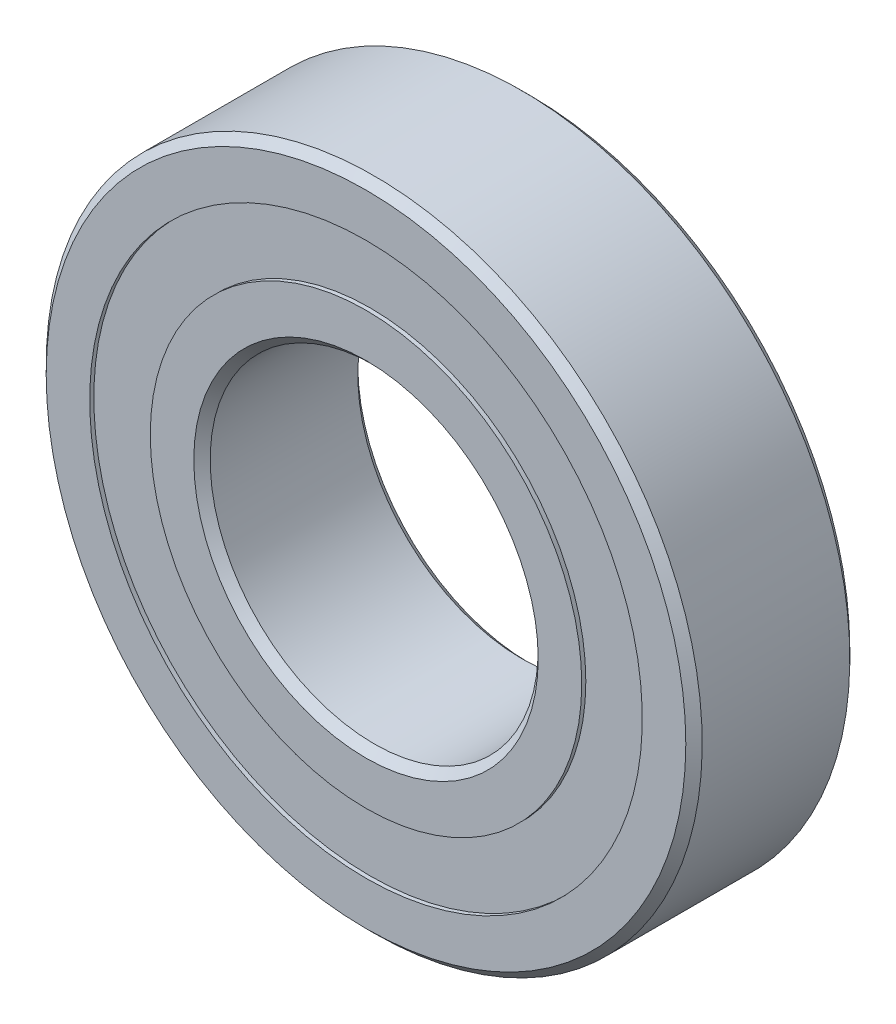
ISO-10303-21;
HEADER;
FILE_DESCRIPTION(('STEP AP214'),'2;1');
FILE_NAME('part.step','',(''),(''),'','','');
FILE_SCHEMA(('AUTOMOTIVE_DESIGN { 1 0 10303 214 1 1 1 1 }'));
ENDSEC;
DATA;
#1=APPLICATION_CONTEXT('core data for automotive mechanical design processes');
#2=APPLICATION_PROTOCOL_DEFINITION('international standard','automotive_design',2000,#1);
#3=PRODUCT_CONTEXT('',#1,'mechanical');
#4=PRODUCT('Part','Part','',(#3));
#5=PRODUCT_RELATED_PRODUCT_CATEGORY('part','',(#4));
#6=PRODUCT_DEFINITION_FORMATION('','',#4);
#7=PRODUCT_DEFINITION_CONTEXT('part definition',#1,'design');
#8=PRODUCT_DEFINITION('design','',#6,#7);
#9=PRODUCT_DEFINITION_SHAPE('','',#8);
#10=(LENGTH_UNIT() NAMED_UNIT(*) SI_UNIT(.MILLI.,.METRE.));
#11=(NAMED_UNIT(*) PLANE_ANGLE_UNIT() SI_UNIT($,.RADIAN.));
#12=(NAMED_UNIT(*) SI_UNIT($,.STERADIAN.) SOLID_ANGLE_UNIT());
#13=UNCERTAINTY_MEASURE_WITH_UNIT(LENGTH_MEASURE(1.E-05),#10,'distance_accuracy_value','');
#14=(GEOMETRIC_REPRESENTATION_CONTEXT(3) GLOBAL_UNCERTAINTY_ASSIGNED_CONTEXT((#13)) GLOBAL_UNIT_ASSIGNED_CONTEXT((#10,
#11,#12)) REPRESENTATION_CONTEXT('',''));
#15=CARTESIAN_POINT('',(0.,0.,0.));
#16=DIRECTION('',(0.,0.,1.));
#17=DIRECTION('',(1.,0.,0.));
#18=AXIS2_PLACEMENT_3D('',#15,#16,#17);
#19=CARTESIAN_POINT('',(0.,21.3946153846154,-6.0325));
#20=DIRECTION('',(0.,0.,1.));
#21=DIRECTION('',(0.,-1.,0.));
#22=AXIS2_PLACEMENT_3D('',#19,#20,#21);
#23=PLANE('',#22);
#24=CARTESIAN_POINT('',(0.,0.,-6.03250000000001));
#25=DIRECTION('',(0.,0.,1.));
#26=DIRECTION('',(0.,-1.,0.));
#27=AXIS2_PLACEMENT_3D('',#24,#25,#26);
#28=CIRCLE('',#27,21.3946153846154);
#29=CARTESIAN_POINT('',(0.,-21.3946153846154,-6.03250000000001));
#30=VERTEX_POINT('',#29);
#31=EDGE_CURVE('E71',#30,#30,#28,.T.);
#32=ORIENTED_EDGE('',*,*,#31,.F.);
#33=EDGE_LOOP('',(#32));
#34=FACE_BOUND('',#33,.T.);
#35=CARTESIAN_POINT('',(0.,0.,-6.03250000000001));
#36=DIRECTION('',(0.,0.,1.));
#37=DIRECTION('',(0.,-1.,0.));
#38=AXIS2_PLACEMENT_3D('',#35,#36,#37);
#39=CIRCLE('',#38,16.7053846153846);
#40=CARTESIAN_POINT('',(0.,-16.7053846153846,-6.03250000000001));
#41=VERTEX_POINT('',#40);
#42=EDGE_CURVE('E11',#41,#41,#39,.T.);
#43=ORIENTED_EDGE('',*,*,#42,.T.);
#44=EDGE_LOOP('',(#43));
#45=FACE_BOUND('',#44,.T.);
#46=ADVANCED_FACE('F54',(#34,#45),#23,.F.);
#47=CARTESIAN_POINT('',(0.,0.,6.35));
#48=DIRECTION('',(0.,0.,1.));
#49=DIRECTION('',(0.,-1.,0.));
#50=AXIS2_PLACEMENT_3D('',#47,#48,#49);
#51=CYLINDRICAL_SURFACE('',#50,16.7053846153846);
#52=ORIENTED_EDGE('',*,*,#42,.F.);
#53=EDGE_LOOP('',(#52));
#54=FACE_BOUND('',#53,.T.);
#55=CARTESIAN_POINT('',(0.,0.,-3.6690815708267));
#56=DIRECTION('',(0.,0.,1.));
#57=DIRECTION('',(0.,-1.,0.));
#58=AXIS2_PLACEMENT_3D('',#55,#56,#57);
#59=CIRCLE('',#58,16.7053846153846);
#60=CARTESIAN_POINT('',(0.,-16.7053846153846,-3.6690815708267));
#61=VERTEX_POINT('',#60);
#62=EDGE_CURVE('E61',#61,#61,#59,.T.);
#63=ORIENTED_EDGE('',*,*,#62,.T.);
#64=EDGE_LOOP('',(#63));
#65=FACE_BOUND('',#64,.T.);
#66=ADVANCED_FACE('F81',(#54,#65),#51,.F.);
#67=CARTESIAN_POINT('',(0.,21.3946153846154,-3.66908157082669));
#68=DIRECTION('',(0.,0.,-1.));
#69=DIRECTION('',(0.,1.,0.));
#70=AXIS2_PLACEMENT_3D('',#67,#68,#69);
#71=PLANE('',#70);
#72=ORIENTED_EDGE('',*,*,#62,.F.);
#73=EDGE_LOOP('',(#72));
#74=FACE_BOUND('',#73,.T.);
#75=CARTESIAN_POINT('',(0.,0.,-3.6690815708267));
#76=DIRECTION('',(0.,0.,1.));
#77=DIRECTION('',(0.,-1.,0.));
#78=AXIS2_PLACEMENT_3D('',#75,#76,#77);
#79=CIRCLE('',#78,21.3946153846154);
#80=CARTESIAN_POINT('',(0.,-21.3946153846154,-3.6690815708267));
#81=VERTEX_POINT('',#80);
#82=EDGE_CURVE('E66',#81,#81,#79,.T.);
#83=ORIENTED_EDGE('',*,*,#82,.T.);
#84=EDGE_LOOP('',(#83));
#85=FACE_BOUND('',#84,.T.);
#86=ADVANCED_FACE('F85',(#74,#85),#71,.F.);
#87=CARTESIAN_POINT('',(0.,0.,6.35));
#88=DIRECTION('',(0.,0.,1.));
#89=DIRECTION('',(0.,-1.,0.));
#90=AXIS2_PLACEMENT_3D('',#87,#88,#89);
#91=CYLINDRICAL_SURFACE('',#90,21.3946153846154);
#92=ORIENTED_EDGE('',*,*,#82,.F.);
#93=EDGE_LOOP('',(#92));
#94=FACE_BOUND('',#93,.T.);
#95=ORIENTED_EDGE('',*,*,#31,.T.);
#96=EDGE_LOOP('',(#95));
#97=FACE_BOUND('',#96,.T.);
#98=ADVANCED_FACE('F78',(#94,#97),#91,.T.);
#99=CLOSED_SHELL('',(#46,#66,#86,#98));
#100=MANIFOLD_SOLID_BREP('B2',#99);
#101=CARTESIAN_POINT('',(0.,21.3946153846154,6.0325));
#102=DIRECTION('',(0.,0.,-1.));
#103=DIRECTION('',(0.,1.,0.));
#104=AXIS2_PLACEMENT_3D('',#101,#102,#103);
#105=PLANE('',#104);
#106=CARTESIAN_POINT('',(0.,0.,6.0325));
#107=DIRECTION('',(0.,0.,1.));
#108=DIRECTION('',(0.,-1.,0.));
#109=AXIS2_PLACEMENT_3D('',#106,#107,#108);
#110=CIRCLE('',#109,16.7053846153846);
#111=CARTESIAN_POINT('',(0.,-16.7053846153846,6.03249999999999));
#112=VERTEX_POINT('',#111);
#113=EDGE_CURVE('E53',#112,#112,#110,.T.);
#114=ORIENTED_EDGE('',*,*,#113,.F.);
#115=EDGE_LOOP('',(#114));
#116=FACE_BOUND('',#115,.T.);
#117=CARTESIAN_POINT('',(0.,0.,6.0325));
#118=DIRECTION('',(0.,0.,1.));
#119=DIRECTION('',(0.,-1.,0.));
#120=AXIS2_PLACEMENT_3D('',#117,#118,#119);
#121=CIRCLE('',#120,21.3946153846154);
#122=CARTESIAN_POINT('',(0.,-21.3946153846154,6.03249999999999));
#123=VERTEX_POINT('',#122);
#124=EDGE_CURVE('E147',#123,#123,#121,.T.);
#125=ORIENTED_EDGE('',*,*,#124,.T.);
#126=EDGE_LOOP('',(#125));
#127=FACE_BOUND('',#126,.T.);
#128=ADVANCED_FACE('F130',(#116,#127),#105,.F.);
#129=CARTESIAN_POINT('',(0.,0.,6.35));
#130=DIRECTION('',(0.,0.,1.));
#131=DIRECTION('',(0.,-1.,0.));
#132=AXIS2_PLACEMENT_3D('',#129,#130,#131);
#133=CYLINDRICAL_SURFACE('',#132,16.7053846153846);
#134=CARTESIAN_POINT('',(0.,0.,3.66908157082669));
#135=DIRECTION('',(0.,0.,1.));
#136=DIRECTION('',(0.,-1.,0.));
#137=AXIS2_PLACEMENT_3D('',#134,#135,#136);
#138=CIRCLE('',#137,16.7053846153846);
#139=CARTESIAN_POINT('',(0.,-16.7053846153846,3.66908157082669));
#140=VERTEX_POINT('',#139);
#141=EDGE_CURVE('E137',#140,#140,#138,.T.);
#142=ORIENTED_EDGE('',*,*,#141,.F.);
#143=EDGE_LOOP('',(#142));
#144=FACE_BOUND('',#143,.T.);
#145=ORIENTED_EDGE('',*,*,#113,.T.);
#146=EDGE_LOOP('',(#145));
#147=FACE_BOUND('',#146,.T.);
#148=ADVANCED_FACE('F163',(#144,#147),#133,.F.);
#149=CARTESIAN_POINT('',(0.,21.3946153846154,3.66908157082669));
#150=DIRECTION('',(0.,0.,1.));
#151=DIRECTION('',(0.,-1.,0.));
#152=AXIS2_PLACEMENT_3D('',#149,#150,#151);
#153=PLANE('',#152);
#154=CARTESIAN_POINT('',(0.,0.,3.66908157082669));
#155=DIRECTION('',(0.,0.,1.));
#156=DIRECTION('',(0.,-1.,0.));
#157=AXIS2_PLACEMENT_3D('',#154,#155,#156);
#158=CIRCLE('',#157,21.3946153846154);
#159=CARTESIAN_POINT('',(0.,-21.3946153846154,3.66908157082669));
#160=VERTEX_POINT('',#159);
#161=EDGE_CURVE('E143',#160,#160,#158,.T.);
#162=ORIENTED_EDGE('',*,*,#161,.F.);
#163=EDGE_LOOP('',(#162));
#164=FACE_BOUND('',#163,.T.);
#165=ORIENTED_EDGE('',*,*,#141,.T.);
#166=EDGE_LOOP('',(#165));
#167=FACE_BOUND('',#166,.T.);
#168=ADVANCED_FACE('F158',(#164,#167),#153,.F.);
#169=CARTESIAN_POINT('',(0.,0.,6.35));
#170=DIRECTION('',(0.,0.,1.));
#171=DIRECTION('',(0.,-1.,0.));
#172=AXIS2_PLACEMENT_3D('',#169,#170,#171);
#173=CYLINDRICAL_SURFACE('',#172,21.3946153846154);
#174=ORIENTED_EDGE('',*,*,#124,.F.);
#175=EDGE_LOOP('',(#174));
#176=FACE_BOUND('',#175,.T.);
#177=ORIENTED_EDGE('',*,*,#161,.T.);
#178=EDGE_LOOP('',(#177));
#179=FACE_BOUND('',#178,.T.);
#180=ADVANCED_FACE('F155',(#176,#179),#173,.T.);
#181=CLOSED_SHELL('',(#128,#148,#168,#180));
#182=MANIFOLD_SOLID_BREP('B6',#181);
#183=CARTESIAN_POINT('',(-9.52499999999979,16.4977839420937,0.));
#184=DIRECTION('',(0.,0.,1.));
#185=DIRECTION('',(-0.499999999999989,0.866025403784445,0.));
#186=AXIS2_PLACEMENT_3D('',#183,#184,#185);
#187=SPHERICAL_SURFACE('',#186,3.66908157082669);
#188=CARTESIAN_POINT('',(-9.52499999999979,16.4977839420937,3.66908157082669));
#189=VERTEX_POINT('',#188);
#190=VERTEX_LOOP('',#189);
#191=FACE_BOUND('',#190,.T.);
#192=ADVANCED_FACE('F225',(#191),#187,.T.);
#193=CLOSED_SHELL('',(#192));
#194=MANIFOLD_SOLID_BREP('B48',#193);
#195=CARTESIAN_POINT('',(-16.4977839420934,9.52500000000019,0.));
#196=DIRECTION('',(0.,0.,1.));
#197=DIRECTION('',(-0.866025403784433,0.50000000000001,0.));
#198=AXIS2_PLACEMENT_3D('',#195,#196,#197);
#199=SPHERICAL_SURFACE('',#198,3.66908157082669);
#200=CARTESIAN_POINT('',(-16.4977839420934,9.52500000000019,3.66908157082669));
#201=VERTEX_POINT('',#200);
#202=VERTEX_LOOP('',#201);
#203=FACE_BOUND('',#202,.T.);
#204=ADVANCED_FACE('F245',(#203),#199,.T.);
#205=CLOSED_SHELL('',(#204));
#206=MANIFOLD_SOLID_BREP('B126',#205);
#207=CARTESIAN_POINT('',(-19.05,1.99538158514885E-13,0.));
#208=DIRECTION('',(0.,0.,1.));
#209=DIRECTION('',(-1.,0.,0.));
#210=AXIS2_PLACEMENT_3D('',#207,#208,#209);
#211=SPHERICAL_SURFACE('',#210,3.66908157082669);
#212=CARTESIAN_POINT('',(-19.05,1.98864159164657E-13,3.66908157082669));
#213=VERTEX_POINT('',#212);
#214=VERTEX_LOOP('',#213);
#215=FACE_BOUND('',#214,.T.);
#216=ADVANCED_FACE('F265',(#215),#211,.T.);
#217=CLOSED_SHELL('',(#216));
#218=MANIFOLD_SOLID_BREP('B221',#217);
#219=CARTESIAN_POINT('',(-16.4977839420936,-9.52499999999985,0.));
#220=DIRECTION('',(0.,0.,1.));
#221=DIRECTION('',(-0.866025403784443,-0.499999999999992,0.));
#222=AXIS2_PLACEMENT_3D('',#219,#220,#221);
#223=SPHERICAL_SURFACE('',#222,3.66908157082669);
#224=CARTESIAN_POINT('',(-16.4977839420936,-9.52499999999985,3.66908157082669));
#225=VERTEX_POINT('',#224);
#226=VERTEX_LOOP('',#225);
#227=FACE_BOUND('',#226,.T.);
#228=ADVANCED_FACE('F285',(#227),#223,.T.);
#229=CLOSED_SHELL('',(#228));
#230=MANIFOLD_SOLID_BREP('B241',#229);
#231=CARTESIAN_POINT('',(-9.52500000000013,-16.4977839420935,0.));
#232=DIRECTION('',(0.,0.,1.));
#233=DIRECTION('',(-0.500000000000007,-0.866025403784435,0.));
#234=AXIS2_PLACEMENT_3D('',#231,#232,#233);
#235=SPHERICAL_SURFACE('',#234,3.66908157082669);
#236=CARTESIAN_POINT('',(-9.52500000000013,-16.4977839420935,3.66908157082669));
#237=VERTEX_POINT('',#236);
#238=VERTEX_LOOP('',#237);
#239=FACE_BOUND('',#238,.T.);
#240=ADVANCED_FACE('F304',(#239),#235,.T.);
#241=CLOSED_SHELL('',(#240));
#242=MANIFOLD_SOLID_BREP('B261',#241);
#243=CARTESIAN_POINT('',(0.,-19.05,0.));
#244=DIRECTION('',(0.,0.,1.));
#245=DIRECTION('',(0.,-1.,0.));
#246=AXIS2_PLACEMENT_3D('',#243,#244,#245);
#247=SPHERICAL_SURFACE('',#246,3.66908157082669);
#248=CARTESIAN_POINT('',(0.,-19.05,3.66908157082669));
#249=VERTEX_POINT('',#248);
#250=VERTEX_LOOP('',#249);
#251=FACE_BOUND('',#250,.T.);
#252=ADVANCED_FACE('F324',(#251),#247,.T.);
#253=CLOSED_SHELL('',(#252));
#254=MANIFOLD_SOLID_BREP('B281',#253);
#255=CARTESIAN_POINT('',(9.5249999999999,-16.4977839420936,0.));
#256=DIRECTION('',(0.,0.,1.));
#257=DIRECTION('',(0.499999999999995,-0.866025403784442,0.));
#258=AXIS2_PLACEMENT_3D('',#255,#256,#257);
#259=SPHERICAL_SURFACE('',#258,3.66908157082669);
#260=CARTESIAN_POINT('',(9.5249999999999,-16.4977839420936,3.66908157082669));
#261=VERTEX_POINT('',#260);
#262=VERTEX_LOOP('',#261);
#263=FACE_BOUND('',#262,.T.);
#264=ADVANCED_FACE('F344',(#263),#259,.T.);
#265=CLOSED_SHELL('',(#264));
#266=MANIFOLD_SOLID_BREP('B300',#265);
#267=CARTESIAN_POINT('',(16.4977839420935,-9.52500000000008,0.));
#268=DIRECTION('',(0.,0.,1.));
#269=DIRECTION('',(0.866025403784436,-0.500000000000004,0.));
#270=AXIS2_PLACEMENT_3D('',#267,#268,#269);
#271=SPHERICAL_SURFACE('',#270,3.66908157082669);
#272=CARTESIAN_POINT('',(16.4977839420935,-9.52500000000008,3.66908157082669));
#273=VERTEX_POINT('',#272);
#274=VERTEX_LOOP('',#273);
#275=FACE_BOUND('',#274,.T.);
#276=ADVANCED_FACE('F364',(#275),#271,.T.);
#277=CLOSED_SHELL('',(#276));
#278=MANIFOLD_SOLID_BREP('B320',#277);
#279=CARTESIAN_POINT('',(19.05,0.,0.));
#280=DIRECTION('',(0.,0.,1.));
#281=DIRECTION('',(1.,0.,0.));
#282=AXIS2_PLACEMENT_3D('',#279,#280,#281);
#283=SPHERICAL_SURFACE('',#282,3.66908157082669);
#284=CARTESIAN_POINT('',(19.05,0.,3.66908157082669));
#285=VERTEX_POINT('',#284);
#286=VERTEX_LOOP('',#285);
#287=FACE_BOUND('',#286,.T.);
#288=ADVANCED_FACE('F384',(#287),#283,.T.);
#289=CLOSED_SHELL('',(#288));
#290=MANIFOLD_SOLID_BREP('B340',#289);
#291=CARTESIAN_POINT('',(16.4977839420936,9.52499999999996,0.));
#292=DIRECTION('',(0.,0.,1.));
#293=DIRECTION('',(0.86602540378444,0.499999999999998,0.));
#294=AXIS2_PLACEMENT_3D('',#291,#292,#293);
#295=SPHERICAL_SURFACE('',#294,3.66908157082669);
#296=CARTESIAN_POINT('',(16.4977839420936,9.52499999999996,3.66908157082669));
#297=VERTEX_POINT('',#296);
#298=VERTEX_LOOP('',#297);
#299=FACE_BOUND('',#298,.T.);
#300=ADVANCED_FACE('F404',(#299),#295,.T.);
#301=CLOSED_SHELL('',(#300));
#302=MANIFOLD_SOLID_BREP('B360',#301);
#303=CARTESIAN_POINT('',(9.52500000000002,16.4977839420935,0.));
#304=DIRECTION('',(0.,0.,1.));
#305=DIRECTION('',(0.500000000000001,0.866025403784438,0.));
#306=AXIS2_PLACEMENT_3D('',#303,#304,#305);
#307=SPHERICAL_SURFACE('',#306,3.66908157082669);
#308=CARTESIAN_POINT('',(9.52500000000002,16.4977839420935,3.66908157082669));
#309=VERTEX_POINT('',#308);
#310=VERTEX_LOOP('',#309);
#311=FACE_BOUND('',#310,.T.);
#312=ADVANCED_FACE('F424',(#311),#307,.T.);
#313=CLOSED_SHELL('',(#312));
#314=MANIFOLD_SOLID_BREP('B380',#313);
#315=CARTESIAN_POINT('',(0.,19.05,0.));
#316=DIRECTION('',(0.,0.,1.));
#317=DIRECTION('',(0.,1.,0.));
#318=AXIS2_PLACEMENT_3D('',#315,#316,#317);
#319=SPHERICAL_SURFACE('',#318,3.66908157082669);
#320=CARTESIAN_POINT('',(0.,19.05,3.66908157082669));
#321=VERTEX_POINT('',#320);
#322=VERTEX_LOOP('',#321);
#323=FACE_BOUND('',#322,.T.);
#324=ADVANCED_FACE('F446',(#323),#319,.T.);
#325=CLOSED_SHELL('',(#324));
#326=MANIFOLD_SOLID_BREP('B400',#325);
#327=CARTESIAN_POINT('',(0.,13.335,6.35000000000001));
#328=DIRECTION('',(0.,0.,-1.));
#329=DIRECTION('',(0.,1.,0.));
#330=AXIS2_PLACEMENT_3D('',#327,#328,#329);
#331=PLANE('',#330);
#332=CARTESIAN_POINT('',(0.,0.,6.35000000000001));
#333=DIRECTION('',(0.,0.,1.));
#334=DIRECTION('',(0.,-1.,0.));
#335=AXIS2_PLACEMENT_3D('',#332,#333,#334);
#336=CIRCLE('',#335,13.335);
#337=CARTESIAN_POINT('',(0.,-13.335,6.35));
#338=VERTEX_POINT('',#337);
#339=EDGE_CURVE('E502',#338,#338,#336,.T.);
#340=ORIENTED_EDGE('',*,*,#339,.F.);
#341=EDGE_LOOP('',(#340));
#342=FACE_BOUND('',#341,.T.);
#343=CARTESIAN_POINT('',(0.,0.,6.35000000000001));
#344=DIRECTION('',(0.,0.,1.));
#345=DIRECTION('',(0.,-1.,0.));
#346=AXIS2_PLACEMENT_3D('',#343,#344,#345);
#347=CIRCLE('',#346,16.7053846153846);
#348=CARTESIAN_POINT('',(0.,-16.7053846153846,6.35));
#349=VERTEX_POINT('',#348);
#350=EDGE_CURVE('E445',#349,#349,#347,.T.);
#351=ORIENTED_EDGE('',*,*,#350,.T.);
#352=EDGE_LOOP('',(#351));
#353=FACE_BOUND('',#352,.T.);
#354=ADVANCED_FACE('F467',(#342,#353),#331,.F.);
#355=CARTESIAN_POINT('',(0.,0.,6.35));
#356=DIRECTION('',(0.,0.,1.));
#357=DIRECTION('',(0.,-1.,0.));
#358=AXIS2_PLACEMENT_3D('',#355,#356,#357);
#359=CYLINDRICAL_SURFACE('',#358,16.7053846153846);
#360=ORIENTED_EDGE('',*,*,#350,.F.);
#361=EDGE_LOOP('',(#360));
#362=FACE_BOUND('',#361,.T.);
#363=CARTESIAN_POINT('',(0.,0.,2.82222222222221));
#364=DIRECTION('',(0.,0.,1.));
#365=DIRECTION('',(0.,-1.,0.));
#366=AXIS2_PLACEMENT_3D('',#363,#364,#365);
#367=CIRCLE('',#366,16.7053846153846);
#368=CARTESIAN_POINT('',(0.,-16.7053846153846,2.82222222222221));
#369=VERTEX_POINT('',#368);
#370=EDGE_CURVE('E474',#369,#369,#367,.T.);
#371=ORIENTED_EDGE('',*,*,#370,.T.);
#372=EDGE_LOOP('',(#371));
#373=FACE_BOUND('',#372,.T.);
#374=ADVANCED_FACE('F510',(#362,#373),#359,.T.);
#375=CARTESIAN_POINT('',(0.,0.,0.));
#376=DIRECTION('',(0.,0.,1.));
#377=DIRECTION('',(0.,-1.,0.));
#378=AXIS2_PLACEMENT_3D('',#375,#376,#377);
#379=TOROIDAL_SURFACE('',#378,19.05,3.66908157082669);
#380=ORIENTED_EDGE('',*,*,#370,.F.);
#381=EDGE_LOOP('',(#380));
#382=FACE_BOUND('',#381,.T.);
#383=CARTESIAN_POINT('',(0.,0.,-2.82222222222222));
#384=DIRECTION('',(0.,0.,1.));
#385=DIRECTION('',(0.,-1.,0.));
#386=AXIS2_PLACEMENT_3D('',#383,#384,#385);
#387=CIRCLE('',#386,16.7053846153846);
#388=CARTESIAN_POINT('',(0.,-16.7053846153846,-2.82222222222222));
#389=VERTEX_POINT('',#388);
#390=EDGE_CURVE('E480',#389,#389,#387,.T.);
#391=ORIENTED_EDGE('',*,*,#390,.T.);
#392=EDGE_LOOP('',(#391));
#393=FACE_BOUND('',#392,.T.);
#394=ADVANCED_FACE('F515',(#382,#393),#379,.F.);
#395=CARTESIAN_POINT('',(0.,0.,6.35));
#396=DIRECTION('',(0.,0.,1.));
#397=DIRECTION('',(0.,-1.,0.));
#398=AXIS2_PLACEMENT_3D('',#395,#396,#397);
#399=CYLINDRICAL_SURFACE('',#398,16.7053846153846);
#400=ORIENTED_EDGE('',*,*,#390,.F.);
#401=EDGE_LOOP('',(#400));
#402=FACE_BOUND('',#401,.T.);
#403=CARTESIAN_POINT('',(0.,0.,-6.35000000000001));
#404=DIRECTION('',(0.,0.,1.));
#405=DIRECTION('',(0.,-1.,0.));
#406=AXIS2_PLACEMENT_3D('',#403,#404,#405);
#407=CIRCLE('',#406,16.7053846153846);
#408=CARTESIAN_POINT('',(0.,-16.7053846153846,-6.35000000000002));
#409=VERTEX_POINT('',#408);
#410=EDGE_CURVE('E485',#409,#409,#407,.T.);
#411=ORIENTED_EDGE('',*,*,#410,.T.);
#412=EDGE_LOOP('',(#411));
#413=FACE_BOUND('',#412,.T.);
#414=ADVANCED_FACE('F520',(#402,#413),#399,.T.);
#415=CARTESIAN_POINT('',(0.,13.335,-6.35000000000001));
#416=DIRECTION('',(0.,0.,1.));
#417=DIRECTION('',(0.,-1.,0.));
#418=AXIS2_PLACEMENT_3D('',#415,#416,#417);
#419=PLANE('',#418);
#420=ORIENTED_EDGE('',*,*,#410,.F.);
#421=EDGE_LOOP('',(#420));
#422=FACE_BOUND('',#421,.T.);
#423=CARTESIAN_POINT('',(0.,0.,-6.35000000000001));
#424=DIRECTION('',(0.,0.,1.));
#425=DIRECTION('',(0.,-1.,0.));
#426=AXIS2_PLACEMENT_3D('',#423,#424,#425);
#427=CIRCLE('',#426,13.335);
#428=CARTESIAN_POINT('',(0.,-13.335,-6.35000000000001));
#429=VERTEX_POINT('',#428);
#430=EDGE_CURVE('E491',#429,#429,#427,.T.);
#431=ORIENTED_EDGE('',*,*,#430,.T.);
#432=EDGE_LOOP('',(#431));
#433=FACE_BOUND('',#432,.T.);
#434=ADVANCED_FACE('F525',(#422,#433),#419,.F.);
#435=CARTESIAN_POINT('',(0.,0.,-5.715));
#436=DIRECTION('',(0.,0.,-1.));
#437=DIRECTION('',(0.,1.,0.));
#438=AXIS2_PLACEMENT_3D('',#435,#436,#437);
#439=CONICAL_SURFACE('',#438,12.7,0.785398163397429);
#440=ORIENTED_EDGE('',*,*,#430,.F.);
#441=EDGE_LOOP('',(#440));
#442=FACE_BOUND('',#441,.T.);
#443=CARTESIAN_POINT('',(0.,0.,-5.715));
#444=DIRECTION('',(0.,0.,1.));
#445=DIRECTION('',(0.,-1.,0.));
#446=AXIS2_PLACEMENT_3D('',#443,#444,#445);
#447=CIRCLE('',#446,12.7);
#448=CARTESIAN_POINT('',(0.,-12.7,-5.715));
#449=VERTEX_POINT('',#448);
#450=EDGE_CURVE('E495',#449,#449,#447,.T.);
#451=ORIENTED_EDGE('',*,*,#450,.T.);
#452=EDGE_LOOP('',(#451));
#453=FACE_BOUND('',#452,.T.);
#454=ADVANCED_FACE('F529',(#442,#453),#439,.F.);
#455=CARTESIAN_POINT('',(0.,0.,6.35));
#456=DIRECTION('',(0.,0.,1.));
#457=DIRECTION('',(0.,-1.,0.));
#458=AXIS2_PLACEMENT_3D('',#455,#456,#457);
#459=CYLINDRICAL_SURFACE('',#458,12.7);
#460=ORIENTED_EDGE('',*,*,#450,.F.);
#461=EDGE_LOOP('',(#460));
#462=FACE_BOUND('',#461,.T.);
#463=CARTESIAN_POINT('',(0.,0.,5.715));
#464=DIRECTION('',(0.,0.,1.));
#465=DIRECTION('',(0.,-1.,0.));
#466=AXIS2_PLACEMENT_3D('',#463,#464,#465);
#467=CIRCLE('',#466,12.7);
#468=CARTESIAN_POINT('',(0.,-12.7,5.715));
#469=VERTEX_POINT('',#468);
#470=EDGE_CURVE('E498',#469,#469,#467,.T.);
#471=ORIENTED_EDGE('',*,*,#470,.T.);
#472=EDGE_LOOP('',(#471));
#473=FACE_BOUND('',#472,.T.);
#474=ADVANCED_FACE('F533',(#462,#473),#459,.F.);
#475=CARTESIAN_POINT('',(0.,0.,6.35000000000001));
#476=DIRECTION('',(0.,0.,1.));
#477=DIRECTION('',(0.,-1.,0.));
#478=AXIS2_PLACEMENT_3D('',#475,#476,#477);
#479=CONICAL_SURFACE('',#478,13.335,0.78539816339743);
#480=ORIENTED_EDGE('',*,*,#470,.F.);
#481=EDGE_LOOP('',(#480));
#482=FACE_BOUND('',#481,.T.);
#483=ORIENTED_EDGE('',*,*,#339,.T.);
#484=EDGE_LOOP('',(#483));
#485=FACE_BOUND('',#484,.T.);
#486=ADVANCED_FACE('F507',(#482,#485),#479,.F.);
#487=CLOSED_SHELL('',(#354,#374,#394,#414,#434,#454,#474,#486));
#488=MANIFOLD_SOLID_BREP('B420',#487);
#489=CARTESIAN_POINT('',(0.,0.,6.35));
#490=DIRECTION('',(0.,0.,1.));
#491=DIRECTION('',(0.,-1.,0.));
#492=AXIS2_PLACEMENT_3D('',#489,#490,#491);
#493=CYLINDRICAL_SURFACE('',#492,25.4);
#494=CARTESIAN_POINT('',(0.,0.,5.715));
#495=DIRECTION('',(0.,0.,1.));
#496=DIRECTION('',(0.,-1.,0.));
#497=AXIS2_PLACEMENT_3D('',#494,#495,#496);
#498=CIRCLE('',#497,25.4);
#499=CARTESIAN_POINT('',(0.,-25.4,5.71499999999999));
#500=VERTEX_POINT('',#499);
#501=EDGE_CURVE('E466',#500,#500,#498,.T.);
#502=ORIENTED_EDGE('',*,*,#501,.F.);
#503=EDGE_LOOP('',(#502));
#504=FACE_BOUND('',#503,.T.);
#505=CARTESIAN_POINT('',(0.,0.,-5.71500000000001));
#506=DIRECTION('',(0.,0.,1.));
#507=DIRECTION('',(0.,-1.,0.));
#508=AXIS2_PLACEMENT_3D('',#505,#506,#507);
#509=CIRCLE('',#508,25.4);
#510=CARTESIAN_POINT('',(0.,-25.4,-5.71500000000001));
#511=VERTEX_POINT('',#510);
#512=EDGE_CURVE('E640',#511,#511,#509,.T.);
#513=ORIENTED_EDGE('',*,*,#512,.T.);
#514=EDGE_LOOP('',(#513));
#515=FACE_BOUND('',#514,.T.);
#516=ADVANCED_FACE('F605',(#504,#515),#493,.T.);
#517=CARTESIAN_POINT('',(0.,0.,5.715));
#518=DIRECTION('',(0.,0.,-1.));
#519=DIRECTION('',(0.,1.,0.));
#520=AXIS2_PLACEMENT_3D('',#517,#518,#519);
#521=CONICAL_SURFACE('',#520,25.4,0.785398163397446);
#522=CARTESIAN_POINT('',(0.,0.,6.35));
#523=DIRECTION('',(0.,0.,1.));
#524=DIRECTION('',(0.,-1.,0.));
#525=AXIS2_PLACEMENT_3D('',#522,#523,#524);
#526=CIRCLE('',#525,24.765);
#527=CARTESIAN_POINT('',(0.,-24.765,6.34999999999999));
#528=VERTEX_POINT('',#527);
#529=EDGE_CURVE('E612',#528,#528,#526,.T.);
#530=ORIENTED_EDGE('',*,*,#529,.F.);
#531=EDGE_LOOP('',(#530));
#532=FACE_BOUND('',#531,.T.);
#533=ORIENTED_EDGE('',*,*,#501,.T.);
#534=EDGE_LOOP('',(#533));
#535=FACE_BOUND('',#534,.T.);
#536=ADVANCED_FACE('F678',(#532,#535),#521,.T.);
#537=CARTESIAN_POINT('',(0.,24.765,6.35));
#538=DIRECTION('',(0.,0.,-1.));
#539=DIRECTION('',(0.,1.,0.));
#540=AXIS2_PLACEMENT_3D('',#537,#538,#539);
#541=PLANE('',#540);
#542=CARTESIAN_POINT('',(0.,0.,6.35));
#543=DIRECTION('',(0.,0.,1.));
#544=DIRECTION('',(0.,-1.,0.));
#545=AXIS2_PLACEMENT_3D('',#542,#543,#544);
#546=CIRCLE('',#545,21.3946153846154);
#547=CARTESIAN_POINT('',(0.,-21.3946153846154,6.34999999999999));
#548=VERTEX_POINT('',#547);
#549=EDGE_CURVE('E618',#548,#548,#546,.T.);
#550=ORIENTED_EDGE('',*,*,#549,.F.);
#551=EDGE_LOOP('',(#550));
#552=FACE_BOUND('',#551,.T.);
#553=ORIENTED_EDGE('',*,*,#529,.T.);
#554=EDGE_LOOP('',(#553));
#555=FACE_BOUND('',#554,.T.);
#556=ADVANCED_FACE('F673',(#552,#555),#541,.F.);
#557=CARTESIAN_POINT('',(0.,0.,6.35));
#558=DIRECTION('',(0.,0.,1.));
#559=DIRECTION('',(0.,-1.,0.));
#560=AXIS2_PLACEMENT_3D('',#557,#558,#559);
#561=CYLINDRICAL_SURFACE('',#560,21.3946153846154);
#562=CARTESIAN_POINT('',(0.,0.,2.82222222222222));
#563=DIRECTION('',(0.,0.,1.));
#564=DIRECTION('',(0.,-1.,0.));
#565=AXIS2_PLACEMENT_3D('',#562,#563,#564);
#566=CIRCLE('',#565,21.3946153846154);
#567=CARTESIAN_POINT('',(0.,-21.3946153846154,2.82222222222222));
#568=VERTEX_POINT('',#567);
#569=EDGE_CURVE('E623',#568,#568,#566,.T.);
#570=ORIENTED_EDGE('',*,*,#569,.F.);
#571=EDGE_LOOP('',(#570));
#572=FACE_BOUND('',#571,.T.);
#573=ORIENTED_EDGE('',*,*,#549,.T.);
#574=EDGE_LOOP('',(#573));
#575=FACE_BOUND('',#574,.T.);
#576=ADVANCED_FACE('F667',(#572,#575),#561,.F.);
#577=CARTESIAN_POINT('',(0.,0.,0.));
#578=DIRECTION('',(0.,0.,1.));
#579=DIRECTION('',(0.,-1.,0.));
#580=AXIS2_PLACEMENT_3D('',#577,#578,#579);
#581=TOROIDAL_SURFACE('',#580,19.05,3.66908157082669);
#582=CARTESIAN_POINT('',(0.,0.,-2.82222222222223));
#583=DIRECTION('',(0.,0.,1.));
#584=DIRECTION('',(0.,-1.,0.));
#585=AXIS2_PLACEMENT_3D('',#582,#583,#584);
#586=CIRCLE('',#585,21.3946153846154);
#587=CARTESIAN_POINT('',(0.,-21.3946153846154,-2.82222222222223));
#588=VERTEX_POINT('',#587);
#589=EDGE_CURVE('E628',#588,#588,#586,.T.);
#590=ORIENTED_EDGE('',*,*,#589,.F.);
#591=EDGE_LOOP('',(#590));
#592=FACE_BOUND('',#591,.T.);
#593=ORIENTED_EDGE('',*,*,#569,.T.);
#594=EDGE_LOOP('',(#593));
#595=FACE_BOUND('',#594,.T.);
#596=ADVANCED_FACE('F661',(#592,#595),#581,.F.);
#597=CARTESIAN_POINT('',(0.,0.,6.35));
#598=DIRECTION('',(0.,0.,1.));
#599=DIRECTION('',(0.,-1.,0.));
#600=AXIS2_PLACEMENT_3D('',#597,#598,#599);
#601=CYLINDRICAL_SURFACE('',#600,21.3946153846154);
#602=CARTESIAN_POINT('',(0.,0.,-6.35));
#603=DIRECTION('',(0.,0.,1.));
#604=DIRECTION('',(0.,-1.,0.));
#605=AXIS2_PLACEMENT_3D('',#602,#603,#604);
#606=CIRCLE('',#605,21.3946153846154);
#607=CARTESIAN_POINT('',(0.,-21.3946153846154,-6.35000000000001));
#608=VERTEX_POINT('',#607);
#609=EDGE_CURVE('E632',#608,#608,#606,.T.);
#610=ORIENTED_EDGE('',*,*,#609,.F.);
#611=EDGE_LOOP('',(#610));
#612=FACE_BOUND('',#611,.T.);
#613=ORIENTED_EDGE('',*,*,#589,.T.);
#614=EDGE_LOOP('',(#613));
#615=FACE_BOUND('',#614,.T.);
#616=ADVANCED_FACE('F655',(#612,#615),#601,.F.);
#617=CARTESIAN_POINT('',(0.,24.765,-6.35));
#618=DIRECTION('',(0.,0.,1.));
#619=DIRECTION('',(0.,-1.,0.));
#620=AXIS2_PLACEMENT_3D('',#617,#618,#619);
#621=PLANE('',#620);
#622=CARTESIAN_POINT('',(0.,0.,-6.35));
#623=DIRECTION('',(0.,0.,1.));
#624=DIRECTION('',(0.,-1.,0.));
#625=AXIS2_PLACEMENT_3D('',#622,#623,#624);
#626=CIRCLE('',#625,24.765);
#627=CARTESIAN_POINT('',(0.,-24.765,-6.35000000000001));
#628=VERTEX_POINT('',#627);
#629=EDGE_CURVE('E636',#628,#628,#626,.T.);
#630=ORIENTED_EDGE('',*,*,#629,.F.);
#631=EDGE_LOOP('',(#630));
#632=FACE_BOUND('',#631,.T.);
#633=ORIENTED_EDGE('',*,*,#609,.T.);
#634=EDGE_LOOP('',(#633));
#635=FACE_BOUND('',#634,.T.);
#636=ADVANCED_FACE('F649',(#632,#635),#621,.F.);
#637=CARTESIAN_POINT('',(0.,0.,-6.35));
#638=DIRECTION('',(0.,0.,1.));
#639=DIRECTION('',(0.,-1.,0.));
#640=AXIS2_PLACEMENT_3D('',#637,#638,#639);
#641=CONICAL_SURFACE('',#640,24.765,0.785398163397446);
#642=ORIENTED_EDGE('',*,*,#512,.F.);
#643=EDGE_LOOP('',(#642));
#644=FACE_BOUND('',#643,.T.);
#645=ORIENTED_EDGE('',*,*,#629,.T.);
#646=EDGE_LOOP('',(#645));
#647=FACE_BOUND('',#646,.T.);
#648=ADVANCED_FACE('F646',(#644,#647),#641,.T.);
#649=CLOSED_SHELL('',(#516,#536,#556,#576,#596,#616,#636,#648));
#650=MANIFOLD_SOLID_BREP('B440',#649);
#651=ADVANCED_BREP_SHAPE_REPRESENTATION('',(#18,#100,#182,#194,#206,#218,#230,#242,#254,#266,
#278,#290,#302,#314,#326,#488,#650),#14);
#652=SHAPE_DEFINITION_REPRESENTATION(#9,#651);
ENDSEC;
END-ISO-10303-21;
